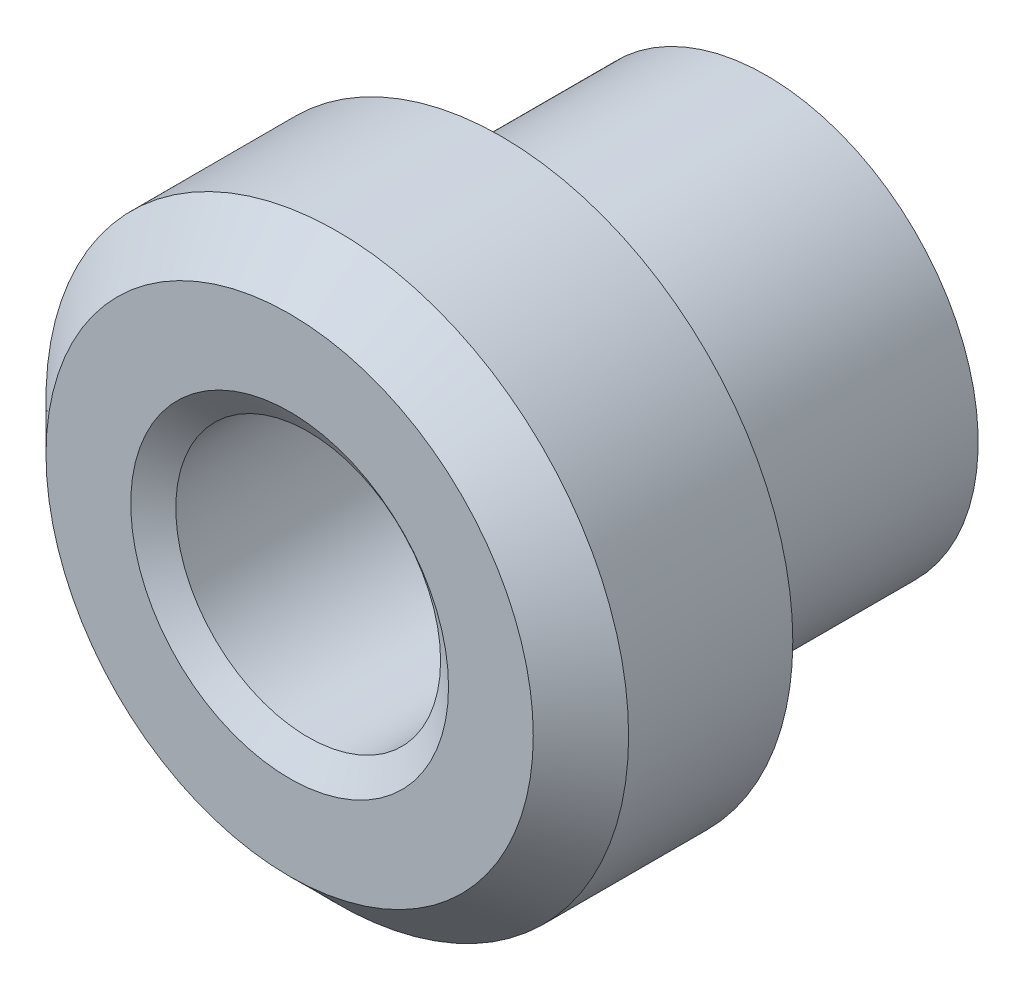
ISO-10303-21;
HEADER;
FILE_DESCRIPTION(('STEP AP214'),'2;1');
FILE_NAME('part.step','',(''),(''),'','','');
FILE_SCHEMA(('AUTOMOTIVE_DESIGN { 1 0 10303 214 1 1 1 1 }'));
ENDSEC;
DATA;
#1=APPLICATION_CONTEXT('core data for automotive mechanical design processes');
#2=APPLICATION_PROTOCOL_DEFINITION('international standard','automotive_design',2000,#1);
#3=PRODUCT_CONTEXT('',#1,'mechanical');
#4=PRODUCT('Part','Part','',(#3));
#5=PRODUCT_RELATED_PRODUCT_CATEGORY('part','',(#4));
#6=PRODUCT_DEFINITION_FORMATION('','',#4);
#7=PRODUCT_DEFINITION_CONTEXT('part definition',#1,'design');
#8=PRODUCT_DEFINITION('design','',#6,#7);
#9=PRODUCT_DEFINITION_SHAPE('','',#8);
#10=(LENGTH_UNIT() NAMED_UNIT(*) SI_UNIT(.MILLI.,.METRE.));
#11=(NAMED_UNIT(*) PLANE_ANGLE_UNIT() SI_UNIT($,.RADIAN.));
#12=(NAMED_UNIT(*) SI_UNIT($,.STERADIAN.) SOLID_ANGLE_UNIT());
#13=UNCERTAINTY_MEASURE_WITH_UNIT(LENGTH_MEASURE(1.E-05),#10,'distance_accuracy_value','');
#14=(GEOMETRIC_REPRESENTATION_CONTEXT(3) GLOBAL_UNCERTAINTY_ASSIGNED_CONTEXT((#13)) GLOBAL_UNIT_ASSIGNED_CONTEXT((#10,
#11,#12)) REPRESENTATION_CONTEXT('',''));
#15=CARTESIAN_POINT('',(0.,0.,0.));
#16=DIRECTION('',(0.,0.,1.));
#17=DIRECTION('',(1.,0.,0.));
#18=AXIS2_PLACEMENT_3D('',#15,#16,#17);
#19=CARTESIAN_POINT('',(0.,0.,-4.5));
#20=DIRECTION('',(0.,0.,1.));
#21=DIRECTION('',(1.,0.,0.));
#22=AXIS2_PLACEMENT_3D('',#19,#20,#21);
#23=PLANE('',#22);
#24=CARTESIAN_POINT('',(0.,0.,-4.5));
#25=DIRECTION('',(0.,0.,1.));
#26=DIRECTION('',(1.,0.,0.));
#27=AXIS2_PLACEMENT_3D('',#24,#25,#26);
#28=CIRCLE('',#27,1.5);
#29=CARTESIAN_POINT('',(1.5,0.,-4.5));
#30=VERTEX_POINT('',#29);
#31=EDGE_CURVE('E64',#30,#30,#28,.F.);
#32=ORIENTED_EDGE('',*,*,#31,.F.);
#33=EDGE_LOOP('',(#32));
#34=FACE_BOUND('',#33,.T.);
#35=CARTESIAN_POINT('',(0.,0.,-4.5));
#36=DIRECTION('',(0.,0.,-1.));
#37=DIRECTION('',(-1.,0.,0.));
#38=AXIS2_PLACEMENT_3D('',#35,#36,#37);
#39=CIRCLE('',#38,2.);
#40=CARTESIAN_POINT('',(-2.,0.,-4.5));
#41=VERTEX_POINT('',#40);
#42=EDGE_CURVE('E74',#41,#41,#39,.T.);
#43=ORIENTED_EDGE('',*,*,#42,.T.);
#44=EDGE_LOOP('',(#43));
#45=FACE_BOUND('',#44,.T.);
#46=ADVANCED_FACE('F45',(#34,#45),#23,.F.);
#47=CARTESIAN_POINT('',(0.,0.,-4.5));
#48=DIRECTION('',(0.,0.,1.));
#49=DIRECTION('',(1.,0.,0.));
#50=AXIS2_PLACEMENT_3D('',#47,#48,#49);
#51=CYLINDRICAL_SURFACE('',#50,2.75);
#52=CARTESIAN_POINT('',(0.,0.,-0.450000000000002));
#53=DIRECTION('',(0.,0.,1.));
#54=DIRECTION('',(1.,0.,0.));
#55=AXIS2_PLACEMENT_3D('',#52,#53,#54);
#56=CIRCLE('',#55,2.75);
#57=CARTESIAN_POINT('',(2.75,0.,-0.450000000000002));
#58=VERTEX_POINT('',#57);
#59=EDGE_CURVE('E13',#58,#58,#56,.F.);
#60=ORIENTED_EDGE('',*,*,#59,.T.);
#61=EDGE_LOOP('',(#60));
#62=FACE_BOUND('',#61,.T.);
#63=CARTESIAN_POINT('',(0.,0.,-2.));
#64=DIRECTION('',(0.,0.,-1.));
#65=DIRECTION('',(-1.,0.,0.));
#66=AXIS2_PLACEMENT_3D('',#63,#64,#65);
#67=CIRCLE('',#66,2.75);
#68=CARTESIAN_POINT('',(-2.75,0.,-2.));
#69=VERTEX_POINT('',#68);
#70=EDGE_CURVE('E49',#69,#69,#67,.F.);
#71=ORIENTED_EDGE('',*,*,#70,.T.);
#72=EDGE_LOOP('',(#71));
#73=FACE_BOUND('',#72,.T.);
#74=ADVANCED_FACE('F84',(#62,#73),#51,.T.);
#75=CARTESIAN_POINT('',(0.,0.,-4.5));
#76=DIRECTION('',(0.,0.,1.));
#77=DIRECTION('',(1.,0.,0.));
#78=AXIS2_PLACEMENT_3D('',#75,#76,#77);
#79=CYLINDRICAL_SURFACE('',#78,1.25);
#80=CARTESIAN_POINT('',(0.,0.,-0.175051884552429));
#81=DIRECTION('',(0.,0.,1.));
#82=DIRECTION('',(1.,0.,0.));
#83=AXIS2_PLACEMENT_3D('',#80,#81,#82);
#84=CIRCLE('',#83,1.25);
#85=CARTESIAN_POINT('',(1.25,0.,-0.175051884552429));
#86=VERTEX_POINT('',#85);
#87=EDGE_CURVE('E57',#86,#86,#84,.F.);
#88=ORIENTED_EDGE('',*,*,#87,.F.);
#89=EDGE_LOOP('',(#88));
#90=FACE_BOUND('',#89,.T.);
#91=CARTESIAN_POINT('',(0.,0.,-4.29954811544757));
#92=DIRECTION('',(0.,0.,-1.));
#93=DIRECTION('',(-1.,0.,0.));
#94=AXIS2_PLACEMENT_3D('',#91,#92,#93);
#95=CIRCLE('',#94,1.25);
#96=CARTESIAN_POINT('',(-1.25,0.,-4.29954811544757));
#97=VERTEX_POINT('',#96);
#98=EDGE_CURVE('E60',#97,#97,#95,.F.);
#99=ORIENTED_EDGE('',*,*,#98,.F.);
#100=EDGE_LOOP('',(#99));
#101=FACE_BOUND('',#100,.T.);
#102=ADVANCED_FACE('F105',(#90,#101),#79,.F.);
#103=CARTESIAN_POINT('',(0.,0.,0.));
#104=DIRECTION('',(0.,0.,1.));
#105=DIRECTION('',(1.,0.,0.));
#106=AXIS2_PLACEMENT_3D('',#103,#104,#105);
#107=PLANE('',#106);
#108=CARTESIAN_POINT('',(0.,0.,0.));
#109=DIRECTION('',(0.,0.,1.));
#110=DIRECTION('',(1.,0.,0.));
#111=AXIS2_PLACEMENT_3D('',#108,#109,#110);
#112=CIRCLE('',#111,2.3);
#113=CARTESIAN_POINT('',(2.3,0.,0.));
#114=VERTEX_POINT('',#113);
#115=EDGE_CURVE('E53',#114,#114,#112,.T.);
#116=ORIENTED_EDGE('',*,*,#115,.T.);
#117=EDGE_LOOP('',(#116));
#118=FACE_BOUND('',#117,.T.);
#119=CARTESIAN_POINT('',(0.,0.,0.));
#120=DIRECTION('',(0.,0.,1.));
#121=DIRECTION('',(1.,0.,0.));
#122=AXIS2_PLACEMENT_3D('',#119,#120,#121);
#123=CIRCLE('',#122,1.5);
#124=CARTESIAN_POINT('',(1.5,0.,0.));
#125=VERTEX_POINT('',#124);
#126=EDGE_CURVE('E63',#125,#125,#123,.T.);
#127=ORIENTED_EDGE('',*,*,#126,.F.);
#128=EDGE_LOOP('',(#127));
#129=FACE_BOUND('',#128,.T.);
#130=ADVANCED_FACE('F111',(#118,#129),#107,.T.);
#131=CARTESIAN_POINT('',(0.,0.,-0.192557073007672));
#132=DIRECTION('',(0.,0.,1.));
#133=DIRECTION('',(1.,0.,0.));
#134=AXIS2_PLACEMENT_3D('',#131,#132,#133);
#135=CONICAL_SURFACE('',#134,1.225,0.959931088596876);
#136=ORIENTED_EDGE('',*,*,#126,.T.);
#137=EDGE_LOOP('',(#136));
#138=FACE_BOUND('',#137,.T.);
#139=ORIENTED_EDGE('',*,*,#87,.T.);
#140=EDGE_LOOP('',(#139));
#141=FACE_BOUND('',#140,.T.);
#142=ADVANCED_FACE('F113',(#138,#141),#135,.F.);
#143=CARTESIAN_POINT('',(0.,0.,-4.4746));
#144=DIRECTION('',(0.,0.,-1.));
#145=DIRECTION('',(-1.,0.,0.));
#146=AXIS2_PLACEMENT_3D('',#143,#144,#145);
#147=CONICAL_SURFACE('',#146,1.5,0.959931088596885);
#148=CARTESIAN_POINT('',(0.,0.,-4.4746));
#149=DIRECTION('',(0.,0.,1.));
#150=DIRECTION('',(1.,0.,0.));
#151=AXIS2_PLACEMENT_3D('',#148,#149,#150);
#152=CIRCLE('',#151,1.5);
#153=CARTESIAN_POINT('',(1.5,0.,-4.4746));
#154=VERTEX_POINT('',#153);
#155=EDGE_CURVE('E67',#154,#154,#152,.T.);
#156=ORIENTED_EDGE('',*,*,#155,.F.);
#157=EDGE_LOOP('',(#156));
#158=FACE_BOUND('',#157,.T.);
#159=ORIENTED_EDGE('',*,*,#98,.T.);
#160=EDGE_LOOP('',(#159));
#161=FACE_BOUND('',#160,.T.);
#162=ADVANCED_FACE('F119',(#158,#161),#147,.F.);
#163=CARTESIAN_POINT('',(0.,0.,-25.0375057290932));
#164=DIRECTION('',(0.,0.,1.));
#165=DIRECTION('',(1.,0.,0.));
#166=AXIS2_PLACEMENT_3D('',#163,#164,#165);
#167=CYLINDRICAL_SURFACE('',#166,1.5);
#168=ORIENTED_EDGE('',*,*,#155,.T.);
#169=EDGE_LOOP('',(#168));
#170=FACE_BOUND('',#169,.T.);
#171=ORIENTED_EDGE('',*,*,#31,.T.);
#172=EDGE_LOOP('',(#171));
#173=FACE_BOUND('',#172,.T.);
#174=ADVANCED_FACE('F96',(#170,#173),#167,.F.);
#175=CARTESIAN_POINT('',(0.,0.,0.));
#176=DIRECTION('',(0.,0.,-1.));
#177=DIRECTION('',(-1.,0.,0.));
#178=AXIS2_PLACEMENT_3D('',#175,#176,#177);
#179=CONICAL_SURFACE('',#178,2.3,0.785398163397446);
#180=ORIENTED_EDGE('',*,*,#59,.F.);
#181=EDGE_LOOP('',(#180));
#182=FACE_BOUND('',#181,.T.);
#183=ORIENTED_EDGE('',*,*,#115,.F.);
#184=EDGE_LOOP('',(#183));
#185=FACE_BOUND('',#184,.T.);
#186=ADVANCED_FACE('F47',(#182,#185),#179,.T.);
#187=CARTESIAN_POINT('',(0.,0.,-2.));
#188=DIRECTION('',(0.,0.,-1.));
#189=DIRECTION('',(-1.,0.,0.));
#190=AXIS2_PLACEMENT_3D('',#187,#188,#189);
#191=PLANE('',#190);
#192=ORIENTED_EDGE('',*,*,#70,.F.);
#193=EDGE_LOOP('',(#192));
#194=FACE_BOUND('',#193,.T.);
#195=CARTESIAN_POINT('',(0.,0.,-2.));
#196=DIRECTION('',(0.,0.,-1.));
#197=DIRECTION('',(-1.,0.,0.));
#198=AXIS2_PLACEMENT_3D('',#195,#196,#197);
#199=CIRCLE('',#198,2.);
#200=CARTESIAN_POINT('',(-2.,0.,-2.));
#201=VERTEX_POINT('',#200);
#202=EDGE_CURVE('E77',#201,#201,#199,.T.);
#203=ORIENTED_EDGE('',*,*,#202,.F.);
#204=EDGE_LOOP('',(#203));
#205=FACE_BOUND('',#204,.T.);
#206=ADVANCED_FACE('F86',(#194,#205),#191,.T.);
#207=CARTESIAN_POINT('',(0.,0.,-2.));
#208=DIRECTION('',(0.,0.,-1.));
#209=DIRECTION('',(-1.,0.,0.));
#210=AXIS2_PLACEMENT_3D('',#207,#208,#209);
#211=CYLINDRICAL_SURFACE('',#210,2.);
#212=ORIENTED_EDGE('',*,*,#202,.T.);
#213=EDGE_LOOP('',(#212));
#214=FACE_BOUND('',#213,.T.);
#215=ORIENTED_EDGE('',*,*,#42,.F.);
#216=EDGE_LOOP('',(#215));
#217=FACE_BOUND('',#216,.T.);
#218=ADVANCED_FACE('F89',(#214,#217),#211,.T.);
#219=CLOSED_SHELL('',(#46,#74,#102,#130,#142,#162,#174,#186,#206,#218));
#220=MANIFOLD_SOLID_BREP('B2',#219);
#221=ADVANCED_BREP_SHAPE_REPRESENTATION('',(#18,#220),#14);
#222=SHAPE_DEFINITION_REPRESENTATION(#9,#221);
ENDSEC;
END-ISO-10303-21;
